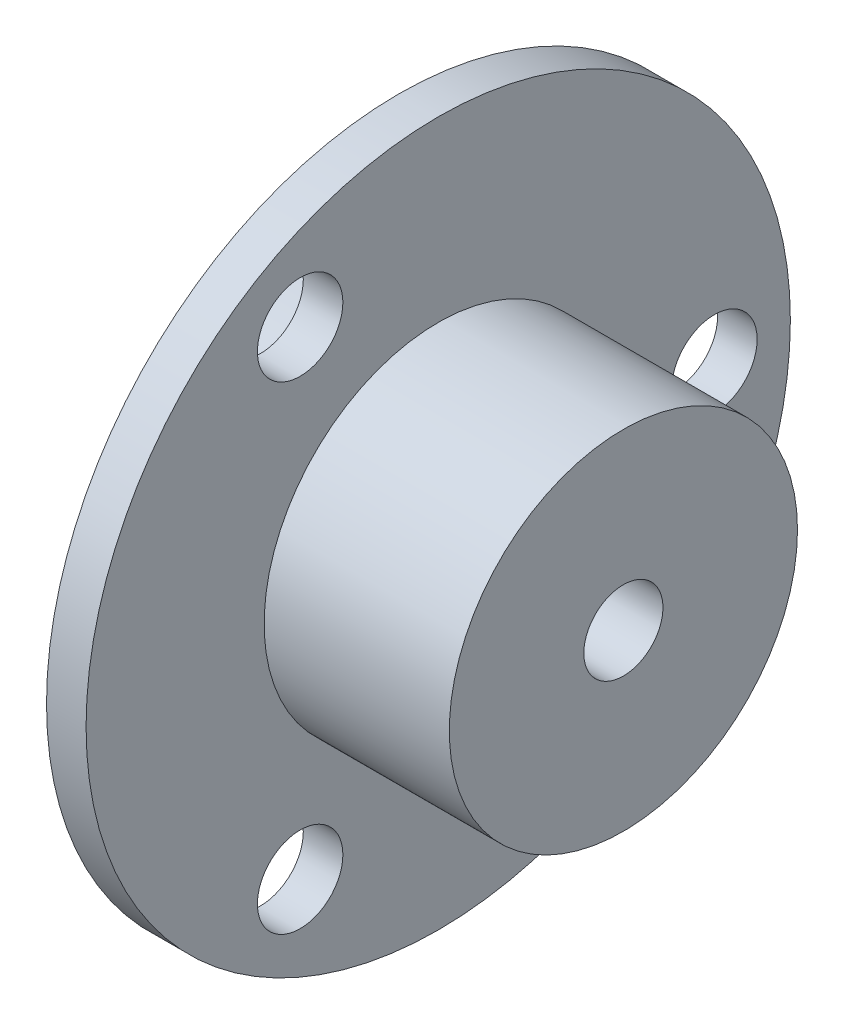
ISO-10303-21;
HEADER;
FILE_DESCRIPTION(('STEP AP214'),'2;1');
FILE_NAME('part.step','',(''),(''),'','','');
FILE_SCHEMA(('AUTOMOTIVE_DESIGN { 1 0 10303 214 1 1 1 1 }'));
ENDSEC;
DATA;
#1=APPLICATION_CONTEXT('core data for automotive mechanical design processes');
#2=APPLICATION_PROTOCOL_DEFINITION('international standard','automotive_design',2000,#1);
#3=PRODUCT_CONTEXT('',#1,'mechanical');
#4=PRODUCT('Part','Part','',(#3));
#5=PRODUCT_RELATED_PRODUCT_CATEGORY('part','',(#4));
#6=PRODUCT_DEFINITION_FORMATION('','',#4);
#7=PRODUCT_DEFINITION_CONTEXT('part definition',#1,'design');
#8=PRODUCT_DEFINITION('design','',#6,#7);
#9=PRODUCT_DEFINITION_SHAPE('','',#8);
#10=(LENGTH_UNIT() NAMED_UNIT(*) SI_UNIT(.MILLI.,.METRE.));
#11=(NAMED_UNIT(*) PLANE_ANGLE_UNIT() SI_UNIT($,.RADIAN.));
#12=(NAMED_UNIT(*) SI_UNIT($,.STERADIAN.) SOLID_ANGLE_UNIT());
#13=UNCERTAINTY_MEASURE_WITH_UNIT(LENGTH_MEASURE(1.E-05),#10,'distance_accuracy_value','');
#14=(GEOMETRIC_REPRESENTATION_CONTEXT(3) GLOBAL_UNCERTAINTY_ASSIGNED_CONTEXT((#13)) GLOBAL_UNIT_ASSIGNED_CONTEXT((#10,
#11,#12)) REPRESENTATION_CONTEXT('',''));
#15=CARTESIAN_POINT('',(0.,0.,0.));
#16=DIRECTION('',(0.,0.,1.));
#17=DIRECTION('',(1.,0.,0.));
#18=AXIS2_PLACEMENT_3D('',#15,#16,#17);
#19=CARTESIAN_POINT('',(2.5,0.,0.));
#20=DIRECTION('',(-1.,0.,0.));
#21=DIRECTION('',(0.,0.,1.));
#22=AXIS2_PLACEMENT_3D('',#19,#20,#21);
#23=CYLINDRICAL_SURFACE('',#22,22.25);
#24=CARTESIAN_POINT('',(2.5,0.,0.));
#25=DIRECTION('',(1.,0.,0.));
#26=DIRECTION('',(0.,0.,-1.));
#27=AXIS2_PLACEMENT_3D('',#24,#25,#26);
#28=CIRCLE('',#27,22.25);
#29=CARTESIAN_POINT('',(2.5,0.,-22.25));
#30=VERTEX_POINT('',#29);
#31=EDGE_CURVE('E37',#30,#30,#28,.T.);
#32=ORIENTED_EDGE('',*,*,#31,.F.);
#33=EDGE_LOOP('',(#32));
#34=FACE_BOUND('',#33,.T.);
#35=CARTESIAN_POINT('',(0.,0.,0.));
#36=DIRECTION('',(1.,0.,0.));
#37=DIRECTION('',(0.,0.,-1.));
#38=AXIS2_PLACEMENT_3D('',#35,#36,#37);
#39=CIRCLE('',#38,22.25);
#40=CARTESIAN_POINT('',(0.,0.,-22.25));
#41=VERTEX_POINT('',#40);
#42=EDGE_CURVE('E41',#41,#41,#39,.T.);
#43=ORIENTED_EDGE('',*,*,#42,.T.);
#44=EDGE_LOOP('',(#43));
#45=FACE_BOUND('',#44,.T.);
#46=ADVANCED_FACE('F31',(#34,#45),#23,.T.);
#47=CARTESIAN_POINT('',(2.5,0.,0.));
#48=DIRECTION('',(1.,0.,0.));
#49=DIRECTION('',(0.,0.,-1.));
#50=AXIS2_PLACEMENT_3D('',#47,#48,#49);
#51=PLANE('',#50);
#52=CARTESIAN_POINT('',(2.5,0.,0.));
#53=DIRECTION('',(1.,0.,0.));
#54=DIRECTION('',(0.,0.,-1.));
#55=AXIS2_PLACEMENT_3D('',#52,#53,#54);
#56=CIRCLE('',#55,11.);
#57=CARTESIAN_POINT('',(2.5,0.,-11.));
#58=VERTEX_POINT('',#57);
#59=EDGE_CURVE('E52',#58,#58,#56,.F.);
#60=ORIENTED_EDGE('',*,*,#59,.T.);
#61=EDGE_LOOP('',(#60));
#62=FACE_BOUND('',#61,.T.);
#63=CARTESIAN_POINT('',(2.5,15.1121432960385,8.72499999999997));
#64=DIRECTION('',(1.,0.,0.));
#65=DIRECTION('',(0.,0.,-1.));
#66=AXIS2_PLACEMENT_3D('',#63,#64,#65);
#67=CIRCLE('',#66,2.7);
#68=CARTESIAN_POINT('',(2.5,15.1121432960385,6.02499999999996));
#69=VERTEX_POINT('',#68);
#70=EDGE_CURVE('E61',#69,#69,#67,.T.);
#71=ORIENTED_EDGE('',*,*,#70,.F.);
#72=EDGE_LOOP('',(#71));
#73=FACE_BOUND('',#72,.T.);
#74=CARTESIAN_POINT('',(2.5,0.,-17.45));
#75=DIRECTION('',(1.,0.,0.));
#76=DIRECTION('',(0.,0.,-1.));
#77=AXIS2_PLACEMENT_3D('',#74,#75,#76);
#78=CIRCLE('',#77,2.7);
#79=CARTESIAN_POINT('',(2.5,0.,-20.15));
#80=VERTEX_POINT('',#79);
#81=EDGE_CURVE('E55',#80,#80,#78,.T.);
#82=ORIENTED_EDGE('',*,*,#81,.F.);
#83=EDGE_LOOP('',(#82));
#84=FACE_BOUND('',#83,.T.);
#85=CARTESIAN_POINT('',(2.5,-15.1121432960385,8.72499999999996));
#86=DIRECTION('',(1.,0.,0.));
#87=DIRECTION('',(0.,0.,-1.));
#88=AXIS2_PLACEMENT_3D('',#85,#86,#87);
#89=CIRCLE('',#88,2.7);
#90=CARTESIAN_POINT('',(2.5,-15.1121432960385,6.02499999999996));
#91=VERTEX_POINT('',#90);
#92=EDGE_CURVE('E48',#91,#91,#89,.T.);
#93=ORIENTED_EDGE('',*,*,#92,.F.);
#94=EDGE_LOOP('',(#93));
#95=FACE_BOUND('',#94,.T.);
#96=ORIENTED_EDGE('',*,*,#31,.T.);
#97=EDGE_LOOP('',(#96));
#98=FACE_BOUND('',#97,.T.);
#99=ADVANCED_FACE('F107',(#62,#73,#84,#95,#98),#51,.T.);
#100=CARTESIAN_POINT('',(0.,0.,0.));
#101=DIRECTION('',(1.,0.,0.));
#102=DIRECTION('',(0.,0.,-1.));
#103=AXIS2_PLACEMENT_3D('',#100,#101,#102);
#104=PLANE('',#103);
#105=CARTESIAN_POINT('',(0.,0.,0.));
#106=DIRECTION('',(1.,0.,0.));
#107=DIRECTION('',(0.,0.,-1.));
#108=AXIS2_PLACEMENT_3D('',#105,#106,#107);
#109=CIRCLE('',#108,11.);
#110=CARTESIAN_POINT('',(0.,0.,-11.));
#111=VERTEX_POINT('',#110);
#112=EDGE_CURVE('E10',#111,#111,#109,.F.);
#113=ORIENTED_EDGE('',*,*,#112,.F.);
#114=EDGE_LOOP('',(#113));
#115=FACE_BOUND('',#114,.T.);
#116=CARTESIAN_POINT('',(0.,15.1121432960385,8.72499999999997));
#117=DIRECTION('',(1.,0.,0.));
#118=DIRECTION('',(0.,0.,-1.));
#119=AXIS2_PLACEMENT_3D('',#116,#117,#118);
#120=CIRCLE('',#119,2.7);
#121=CARTESIAN_POINT('',(0.,15.1121432960385,6.02499999999996));
#122=VERTEX_POINT('',#121);
#123=EDGE_CURVE('E46',#122,#122,#120,.T.);
#124=ORIENTED_EDGE('',*,*,#123,.T.);
#125=EDGE_LOOP('',(#124));
#126=FACE_BOUND('',#125,.T.);
#127=CARTESIAN_POINT('',(0.,0.,-17.45));
#128=DIRECTION('',(1.,0.,0.));
#129=DIRECTION('',(0.,0.,-1.));
#130=AXIS2_PLACEMENT_3D('',#127,#128,#129);
#131=CIRCLE('',#130,2.7);
#132=CARTESIAN_POINT('',(0.,0.,-20.15));
#133=VERTEX_POINT('',#132);
#134=EDGE_CURVE('E58',#133,#133,#131,.T.);
#135=ORIENTED_EDGE('',*,*,#134,.T.);
#136=EDGE_LOOP('',(#135));
#137=FACE_BOUND('',#136,.T.);
#138=CARTESIAN_POINT('',(0.,-15.1121432960385,8.72499999999996));
#139=DIRECTION('',(1.,0.,0.));
#140=DIRECTION('',(0.,0.,-1.));
#141=AXIS2_PLACEMENT_3D('',#138,#139,#140);
#142=CIRCLE('',#141,2.7);
#143=CARTESIAN_POINT('',(0.,-15.1121432960385,6.02499999999996));
#144=VERTEX_POINT('',#143);
#145=EDGE_CURVE('E51',#144,#144,#142,.T.);
#146=ORIENTED_EDGE('',*,*,#145,.T.);
#147=EDGE_LOOP('',(#146));
#148=FACE_BOUND('',#147,.T.);
#149=ORIENTED_EDGE('',*,*,#42,.F.);
#150=EDGE_LOOP('',(#149));
#151=FACE_BOUND('',#150,.T.);
#152=ADVANCED_FACE('F112',(#115,#126,#137,#148,#151),#104,.F.);
#153=CARTESIAN_POINT('',(0.,-15.1121432960385,8.72499999999996));
#154=DIRECTION('',(1.,0.,0.));
#155=DIRECTION('',(0.,0.,-1.));
#156=AXIS2_PLACEMENT_3D('',#153,#154,#155);
#157=CYLINDRICAL_SURFACE('',#156,2.7);
#158=ORIENTED_EDGE('',*,*,#145,.F.);
#159=EDGE_LOOP('',(#158));
#160=FACE_BOUND('',#159,.T.);
#161=ORIENTED_EDGE('',*,*,#92,.T.);
#162=EDGE_LOOP('',(#161));
#163=FACE_BOUND('',#162,.T.);
#164=ADVANCED_FACE('F119',(#160,#163),#157,.F.);
#165=CARTESIAN_POINT('',(0.,0.,-17.45));
#166=DIRECTION('',(1.,0.,0.));
#167=DIRECTION('',(0.,0.,-1.));
#168=AXIS2_PLACEMENT_3D('',#165,#166,#167);
#169=CYLINDRICAL_SURFACE('',#168,2.7);
#170=ORIENTED_EDGE('',*,*,#134,.F.);
#171=EDGE_LOOP('',(#170));
#172=FACE_BOUND('',#171,.T.);
#173=ORIENTED_EDGE('',*,*,#81,.T.);
#174=EDGE_LOOP('',(#173));
#175=FACE_BOUND('',#174,.T.);
#176=ADVANCED_FACE('F124',(#172,#175),#169,.F.);
#177=CARTESIAN_POINT('',(0.,15.1121432960385,8.72499999999997));
#178=DIRECTION('',(1.,0.,0.));
#179=DIRECTION('',(0.,0.,-1.));
#180=AXIS2_PLACEMENT_3D('',#177,#178,#179);
#181=CYLINDRICAL_SURFACE('',#180,2.7);
#182=ORIENTED_EDGE('',*,*,#123,.F.);
#183=EDGE_LOOP('',(#182));
#184=FACE_BOUND('',#183,.T.);
#185=ORIENTED_EDGE('',*,*,#70,.T.);
#186=EDGE_LOOP('',(#185));
#187=FACE_BOUND('',#186,.T.);
#188=ADVANCED_FACE('F94',(#184,#187),#181,.F.);
#189=CARTESIAN_POINT('',(-4.8,0.,0.));
#190=DIRECTION('',(1.,0.,0.));
#191=DIRECTION('',(0.,0.,-1.));
#192=AXIS2_PLACEMENT_3D('',#189,#190,#191);
#193=PLANE('',#192);
#194=CARTESIAN_POINT('',(-4.8,0.,0.));
#195=DIRECTION('',(-1.,0.,0.));
#196=DIRECTION('',(0.,0.,1.));
#197=AXIS2_PLACEMENT_3D('',#194,#195,#196);
#198=CIRCLE('',#197,2.5);
#199=CARTESIAN_POINT('',(-4.8,0.,2.5));
#200=VERTEX_POINT('',#199);
#201=EDGE_CURVE('E75',#200,#200,#198,.T.);
#202=ORIENTED_EDGE('',*,*,#201,.F.);
#203=EDGE_LOOP('',(#202));
#204=FACE_BOUND('',#203,.T.);
#205=CARTESIAN_POINT('',(-4.8,0.,0.));
#206=DIRECTION('',(1.,0.,0.));
#207=DIRECTION('',(0.,0.,-1.));
#208=AXIS2_PLACEMENT_3D('',#205,#206,#207);
#209=CIRCLE('',#208,11.);
#210=CARTESIAN_POINT('',(-4.8,0.,-11.));
#211=VERTEX_POINT('',#210);
#212=EDGE_CURVE('E69',#211,#211,#209,.T.);
#213=ORIENTED_EDGE('',*,*,#212,.F.);
#214=EDGE_LOOP('',(#213));
#215=FACE_BOUND('',#214,.T.);
#216=ADVANCED_FACE('F90',(#204,#215),#193,.F.);
#217=CARTESIAN_POINT('',(14.2,0.,0.));
#218=DIRECTION('',(-1.,0.,0.));
#219=DIRECTION('',(0.,0.,1.));
#220=AXIS2_PLACEMENT_3D('',#217,#218,#219);
#221=CYLINDRICAL_SURFACE('',#220,11.);
#222=ORIENTED_EDGE('',*,*,#212,.T.);
#223=EDGE_LOOP('',(#222));
#224=FACE_BOUND('',#223,.T.);
#225=ORIENTED_EDGE('',*,*,#112,.T.);
#226=EDGE_LOOP('',(#225));
#227=FACE_BOUND('',#226,.T.);
#228=ADVANCED_FACE('F93',(#224,#227),#221,.T.);
#229=ORIENTED_EDGE('',*,*,#59,.F.);
#230=EDGE_LOOP('',(#229));
#231=FACE_BOUND('',#230,.T.);
#232=CARTESIAN_POINT('',(14.2,0.,0.));
#233=DIRECTION('',(1.,0.,0.));
#234=DIRECTION('',(0.,0.,-1.));
#235=AXIS2_PLACEMENT_3D('',#232,#233,#234);
#236=CIRCLE('',#235,11.);
#237=CARTESIAN_POINT('',(14.2,0.,-11.));
#238=VERTEX_POINT('',#237);
#239=EDGE_CURVE('E68',#238,#238,#236,.T.);
#240=ORIENTED_EDGE('',*,*,#239,.F.);
#241=EDGE_LOOP('',(#240));
#242=FACE_BOUND('',#241,.T.);
#243=ADVANCED_FACE('F99',(#231,#242),#221,.T.);
#244=CARTESIAN_POINT('',(14.2,0.,0.));
#245=DIRECTION('',(1.,0.,0.));
#246=DIRECTION('',(0.,0.,-1.));
#247=AXIS2_PLACEMENT_3D('',#244,#245,#246);
#248=PLANE('',#247);
#249=CARTESIAN_POINT('',(14.2,0.,0.));
#250=DIRECTION('',(-1.,0.,0.));
#251=DIRECTION('',(0.,0.,1.));
#252=AXIS2_PLACEMENT_3D('',#249,#250,#251);
#253=CIRCLE('',#252,2.5);
#254=CARTESIAN_POINT('',(14.2,0.,2.5));
#255=VERTEX_POINT('',#254);
#256=EDGE_CURVE('E72',#255,#255,#253,.T.);
#257=ORIENTED_EDGE('',*,*,#256,.T.);
#258=EDGE_LOOP('',(#257));
#259=FACE_BOUND('',#258,.T.);
#260=ORIENTED_EDGE('',*,*,#239,.T.);
#261=EDGE_LOOP('',(#260));
#262=FACE_BOUND('',#261,.T.);
#263=ADVANCED_FACE('F81',(#259,#262),#248,.T.);
#264=CARTESIAN_POINT('',(14.2,0.,0.));
#265=DIRECTION('',(-1.,0.,0.));
#266=DIRECTION('',(0.,0.,1.));
#267=AXIS2_PLACEMENT_3D('',#264,#265,#266);
#268=CYLINDRICAL_SURFACE('',#267,2.5);
#269=ORIENTED_EDGE('',*,*,#256,.F.);
#270=EDGE_LOOP('',(#269));
#271=FACE_BOUND('',#270,.T.);
#272=ORIENTED_EDGE('',*,*,#201,.T.);
#273=EDGE_LOOP('',(#272));
#274=FACE_BOUND('',#273,.T.);
#275=ADVANCED_FACE('F84',(#271,#274),#268,.F.);
#276=CLOSED_SHELL('',(#46,#99,#152,#164,#176,#188,#216,#228,#243,#263,#275));
#277=MANIFOLD_SOLID_BREP('B2',#276);
#278=ADVANCED_BREP_SHAPE_REPRESENTATION('',(#18,#277),#14);
#279=SHAPE_DEFINITION_REPRESENTATION(#9,#278);
ENDSEC;
END-ISO-10303-21;
